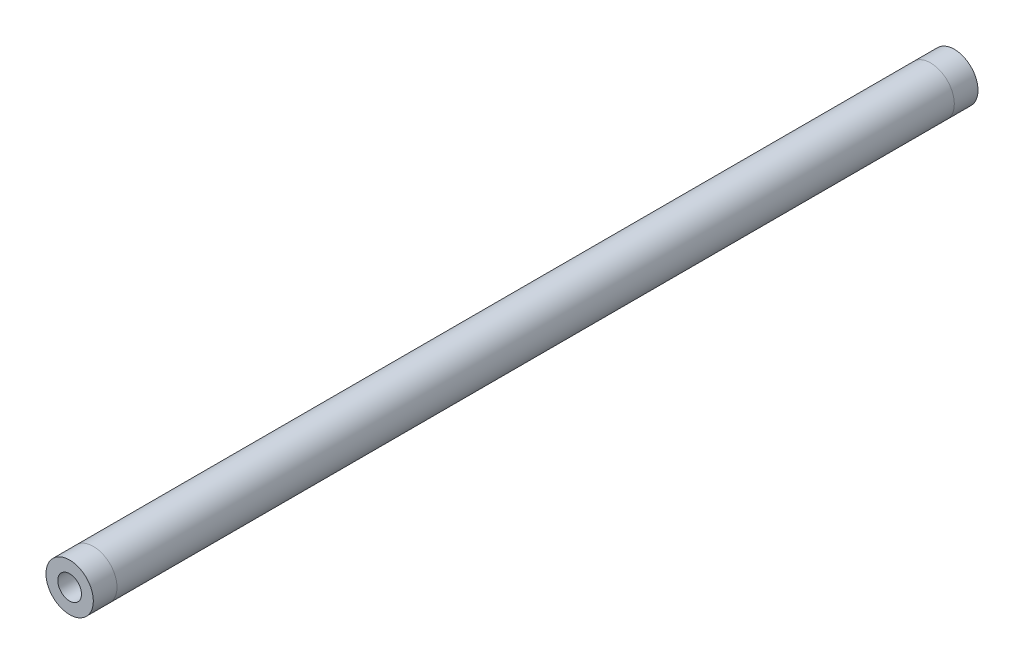
ISO-10303-21;
HEADER;
FILE_DESCRIPTION(('STEP AP214'),'2;1');
FILE_NAME('part.step','',(''),(''),'','','');
FILE_SCHEMA(('AUTOMOTIVE_DESIGN { 1 0 10303 214 1 1 1 1 }'));
ENDSEC;
DATA;
#1=APPLICATION_CONTEXT('core data for automotive mechanical design processes');
#2=APPLICATION_PROTOCOL_DEFINITION('international standard','automotive_design',2000,#1);
#3=PRODUCT_CONTEXT('',#1,'mechanical');
#4=PRODUCT('Part','Part','',(#3));
#5=PRODUCT_RELATED_PRODUCT_CATEGORY('part','',(#4));
#6=PRODUCT_DEFINITION_FORMATION('','',#4);
#7=PRODUCT_DEFINITION_CONTEXT('part definition',#1,'design');
#8=PRODUCT_DEFINITION('design','',#6,#7);
#9=PRODUCT_DEFINITION_SHAPE('','',#8);
#10=(LENGTH_UNIT() NAMED_UNIT(*) SI_UNIT(.MILLI.,.METRE.));
#11=(NAMED_UNIT(*) PLANE_ANGLE_UNIT() SI_UNIT($,.RADIAN.));
#12=(NAMED_UNIT(*) SI_UNIT($,.STERADIAN.) SOLID_ANGLE_UNIT());
#13=UNCERTAINTY_MEASURE_WITH_UNIT(LENGTH_MEASURE(1.E-05),#10,'distance_accuracy_value','');
#14=(GEOMETRIC_REPRESENTATION_CONTEXT(3) GLOBAL_UNCERTAINTY_ASSIGNED_CONTEXT((#13)) GLOBAL_UNIT_ASSIGNED_CONTEXT((#10,
#11,#12)) REPRESENTATION_CONTEXT('',''));
#15=CARTESIAN_POINT('',(0.,0.,0.));
#16=DIRECTION('',(0.,0.,1.));
#17=DIRECTION('',(1.,0.,0.));
#18=AXIS2_PLACEMENT_3D('',#15,#16,#17);
#19=CARTESIAN_POINT('',(0.,0.,-237.20562968286));
#20=DIRECTION('',(0.,0.,1.));
#21=DIRECTION('',(1.,0.,0.));
#22=AXIS2_PLACEMENT_3D('',#19,#20,#21);
#23=CYLINDRICAL_SURFACE('',#22,6.35);
#24=CARTESIAN_POINT('',(0.,0.,-237.20562968286));
#25=DIRECTION('',(0.,0.,1.));
#26=DIRECTION('',(1.,0.,0.));
#27=AXIS2_PLACEMENT_3D('',#24,#25,#26);
#28=CIRCLE('',#27,6.35);
#29=CARTESIAN_POINT('',(6.35,0.,-237.20562968286));
#30=VERTEX_POINT('',#29);
#31=EDGE_CURVE('E83',#30,#30,#28,.T.);
#32=ORIENTED_EDGE('',*,*,#31,.T.);
#33=EDGE_LOOP('',(#32));
#34=FACE_BOUND('',#33,.T.);
#35=CARTESIAN_POINT('',(0.,0.,-230.85562968286));
#36=DIRECTION('',(0.,0.,1.));
#37=DIRECTION('',(1.,0.,0.));
#38=AXIS2_PLACEMENT_3D('',#35,#36,#37);
#39=CIRCLE('',#38,6.35);
#40=CARTESIAN_POINT('',(6.35,0.,-230.85562968286));
#41=VERTEX_POINT('',#40);
#42=EDGE_CURVE('E79',#41,#41,#39,.T.);
#43=ORIENTED_EDGE('',*,*,#42,.F.);
#44=EDGE_LOOP('',(#43));
#45=FACE_BOUND('',#44,.T.);
#46=ADVANCED_FACE('F76',(#34,#45),#23,.T.);
#47=CARTESIAN_POINT('',(0.,0.,-237.20562968286));
#48=DIRECTION('',(0.,0.,1.));
#49=DIRECTION('',(1.,0.,0.));
#50=AXIS2_PLACEMENT_3D('',#47,#48,#49);
#51=PLANE('',#50);
#52=CARTESIAN_POINT('',(0.,0.,-237.20562968286));
#53=DIRECTION('',(0.,0.,1.));
#54=DIRECTION('',(1.,0.,0.));
#55=AXIS2_PLACEMENT_3D('',#52,#53,#54);
#56=CIRCLE('',#55,3.175);
#57=CARTESIAN_POINT('',(3.175,0.,-237.20562968286));
#58=VERTEX_POINT('',#57);
#59=EDGE_CURVE('E92',#58,#58,#56,.T.);
#60=ORIENTED_EDGE('',*,*,#59,.T.);
#61=EDGE_LOOP('',(#60));
#62=FACE_BOUND('',#61,.T.);
#63=ORIENTED_EDGE('',*,*,#31,.F.);
#64=EDGE_LOOP('',(#63));
#65=FACE_BOUND('',#64,.T.);
#66=ADVANCED_FACE('F119',(#62,#65),#51,.F.);
#67=CARTESIAN_POINT('',(0.,0.,-230.85562968286));
#68=DIRECTION('',(0.,0.,1.));
#69=DIRECTION('',(1.,0.,0.));
#70=AXIS2_PLACEMENT_3D('',#67,#68,#69);
#71=PLANE('',#70);
#72=CARTESIAN_POINT('',(0.,0.,-230.85562968286));
#73=DIRECTION('',(0.,0.,1.));
#74=DIRECTION('',(1.,0.,0.));
#75=AXIS2_PLACEMENT_3D('',#72,#73,#74);
#76=CIRCLE('',#75,4.826);
#77=CARTESIAN_POINT('',(-4.826,0.,-230.85562968286));
#78=VERTEX_POINT('',#77);
#79=EDGE_CURVE('E12',#78,#78,#76,.T.);
#80=ORIENTED_EDGE('',*,*,#79,.F.);
#81=EDGE_LOOP('',(#80));
#82=FACE_BOUND('',#81,.T.);
#83=ORIENTED_EDGE('',*,*,#42,.T.);
#84=EDGE_LOOP('',(#83));
#85=FACE_BOUND('',#84,.T.);
#86=ADVANCED_FACE('F115',(#82,#85),#71,.T.);
#87=CARTESIAN_POINT('',(0.,0.,-237.20562968286));
#88=DIRECTION('',(0.,0.,1.));
#89=DIRECTION('',(1.,0.,0.));
#90=AXIS2_PLACEMENT_3D('',#87,#88,#89);
#91=CYLINDRICAL_SURFACE('',#90,3.175);
#92=ORIENTED_EDGE('',*,*,#59,.F.);
#93=EDGE_LOOP('',(#92));
#94=FACE_BOUND('',#93,.T.);
#95=CARTESIAN_POINT('',(0.,0.,-221.33062968286));
#96=DIRECTION('',(0.,0.,1.));
#97=DIRECTION('',(1.,0.,0.));
#98=AXIS2_PLACEMENT_3D('',#95,#96,#97);
#99=CIRCLE('',#98,3.175);
#100=CARTESIAN_POINT('',(3.175,0.,-221.33062968286));
#101=VERTEX_POINT('',#100);
#102=EDGE_CURVE('E98',#101,#101,#99,.T.);
#103=ORIENTED_EDGE('',*,*,#102,.T.);
#104=EDGE_LOOP('',(#103));
#105=FACE_BOUND('',#104,.T.);
#106=ADVANCED_FACE('F104',(#94,#105),#91,.F.);
#107=CARTESIAN_POINT('',(0.,0.,-221.33062968286));
#108=DIRECTION('',(0.,0.,1.));
#109=DIRECTION('',(1.,0.,0.));
#110=AXIS2_PLACEMENT_3D('',#107,#108,#109);
#111=PLANE('',#110);
#112=CARTESIAN_POINT('',(0.,0.,-221.33062968286));
#113=DIRECTION('',(0.,0.,1.));
#114=DIRECTION('',(1.,0.,0.));
#115=AXIS2_PLACEMENT_3D('',#112,#113,#114);
#116=CIRCLE('',#115,4.826);
#117=CARTESIAN_POINT('',(-4.826,0.,-221.33062968286));
#118=VERTEX_POINT('',#117);
#119=EDGE_CURVE('E90',#118,#118,#116,.T.);
#120=ORIENTED_EDGE('',*,*,#119,.T.);
#121=EDGE_LOOP('',(#120));
#122=FACE_BOUND('',#121,.T.);
#123=ORIENTED_EDGE('',*,*,#102,.F.);
#124=EDGE_LOOP('',(#123));
#125=FACE_BOUND('',#124,.T.);
#126=ADVANCED_FACE('F106',(#122,#125),#111,.T.);
#127=CARTESIAN_POINT('',(0.,0.,-221.33062968286));
#128=DIRECTION('',(0.,0.,-1.));
#129=DIRECTION('',(-1.,0.,0.));
#130=AXIS2_PLACEMENT_3D('',#127,#128,#129);
#131=CYLINDRICAL_SURFACE('',#130,4.826);
#132=CARTESIAN_POINT('',(-4.826,0.,-221.33062968286));
#133=CARTESIAN_POINT('',(-4.826,0.,-221.42984843286));
#134=CARTESIAN_POINT('',(-4.826,0.,-221.52906718286));
#135=CARTESIAN_POINT('',(-4.826,0.,-221.72750468286));
#136=CARTESIAN_POINT('',(-4.826,0.,-221.82672343286));
#137=CARTESIAN_POINT('',(-4.826,0.,-222.02516093286));
#138=CARTESIAN_POINT('',(-4.826,0.,-222.12437968286));
#139=CARTESIAN_POINT('',(-4.826,0.,-222.32281718286));
#140=CARTESIAN_POINT('',(-4.826,0.,-222.42203593286));
#141=CARTESIAN_POINT('',(-4.826,0.,-222.62047343286));
#142=CARTESIAN_POINT('',(-4.826,0.,-222.71969218286));
#143=CARTESIAN_POINT('',(-4.826,0.,-222.91812968286));
#144=CARTESIAN_POINT('',(-4.826,0.,-223.01734843286));
#145=CARTESIAN_POINT('',(-4.826,0.,-223.21578593286));
#146=CARTESIAN_POINT('',(-4.826,0.,-223.31500468286));
#147=CARTESIAN_POINT('',(-4.826,0.,-223.51344218286));
#148=CARTESIAN_POINT('',(-4.826,0.,-223.61266093286));
#149=CARTESIAN_POINT('',(-4.826,0.,-223.81109843286));
#150=CARTESIAN_POINT('',(-4.826,0.,-223.91031718286));
#151=CARTESIAN_POINT('',(-4.826,0.,-224.10875468286));
#152=CARTESIAN_POINT('',(-4.826,0.,-224.20797343286));
#153=CARTESIAN_POINT('',(-4.826,0.,-224.40641093286));
#154=CARTESIAN_POINT('',(-4.826,0.,-224.50562968286));
#155=CARTESIAN_POINT('',(-4.826,0.,-224.70406718286));
#156=CARTESIAN_POINT('',(-4.826,0.,-224.80328593286));
#157=CARTESIAN_POINT('',(-4.826,0.,-225.00172343286));
#158=CARTESIAN_POINT('',(-4.826,0.,-225.10094218286));
#159=CARTESIAN_POINT('',(-4.826,0.,-225.29937968286));
#160=CARTESIAN_POINT('',(-4.826,0.,-225.39859843286));
#161=CARTESIAN_POINT('',(-4.826,0.,-225.59703593286));
#162=CARTESIAN_POINT('',(-4.826,0.,-225.69625468286));
#163=CARTESIAN_POINT('',(-4.826,0.,-225.89469218286));
#164=CARTESIAN_POINT('',(-4.826,0.,-225.99391093286));
#165=CARTESIAN_POINT('',(-4.826,0.,-226.19234843286));
#166=CARTESIAN_POINT('',(-4.826,0.,-226.29156718286));
#167=CARTESIAN_POINT('',(-4.826,0.,-226.49000468286));
#168=CARTESIAN_POINT('',(-4.826,0.,-226.58922343286));
#169=CARTESIAN_POINT('',(-4.826,0.,-226.78766093286));
#170=CARTESIAN_POINT('',(-4.826,0.,-226.88687968286));
#171=CARTESIAN_POINT('',(-4.826,0.,-227.08531718286));
#172=CARTESIAN_POINT('',(-4.826,0.,-227.18453593286));
#173=CARTESIAN_POINT('',(-4.826,0.,-227.38297343286));
#174=CARTESIAN_POINT('',(-4.826,0.,-227.48219218286));
#175=CARTESIAN_POINT('',(-4.826,0.,-227.68062968286));
#176=CARTESIAN_POINT('',(-4.826,0.,-227.77984843286));
#177=CARTESIAN_POINT('',(-4.826,0.,-227.97828593286));
#178=CARTESIAN_POINT('',(-4.826,0.,-228.07750468286));
#179=CARTESIAN_POINT('',(-4.826,0.,-228.27594218286));
#180=CARTESIAN_POINT('',(-4.826,0.,-228.37516093286));
#181=CARTESIAN_POINT('',(-4.826,0.,-228.57359843286));
#182=CARTESIAN_POINT('',(-4.826,0.,-228.67281718286));
#183=CARTESIAN_POINT('',(-4.826,0.,-228.87125468286));
#184=CARTESIAN_POINT('',(-4.826,0.,-228.97047343286));
#185=CARTESIAN_POINT('',(-4.826,0.,-229.16891093286));
#186=CARTESIAN_POINT('',(-4.826,0.,-229.26812968286));
#187=CARTESIAN_POINT('',(-4.826,0.,-229.46656718286));
#188=CARTESIAN_POINT('',(-4.826,0.,-229.56578593286));
#189=CARTESIAN_POINT('',(-4.826,0.,-229.76422343286));
#190=CARTESIAN_POINT('',(-4.826,0.,-229.86344218286));
#191=CARTESIAN_POINT('',(-4.826,0.,-230.06187968286));
#192=CARTESIAN_POINT('',(-4.826,0.,-230.16109843286));
#193=CARTESIAN_POINT('',(-4.826,0.,-230.35953593286));
#194=CARTESIAN_POINT('',(-4.826,0.,-230.45875468286));
#195=CARTESIAN_POINT('',(-4.826,0.,-230.65719218286));
#196=CARTESIAN_POINT('',(-4.826,0.,-230.75641093286));
#197=CARTESIAN_POINT('',(-4.826,0.,-230.85562968286));
#198=B_SPLINE_CURVE_WITH_KNOTS('',3,(#132,#133,#134,#135,#136,#137,#138,#139,#140,#141,#142,
#143,#144,#145,#146,#147,#148,#149,#150,#151,#152,#153,#154,#155,#156,#157,#158,#159,#160,#161,
#162,#163,#164,#165,#166,#167,#168,#169,#170,#171,#172,#173,#174,#175,#176,#177,#178,#179,#180,
#181,#182,#183,#184,#185,#186,#187,#188,#189,#190,#191,#192,#193,#194,#195,#196,#197),
.UNSPECIFIED.,.F.,.F.,(4,2,2,2,2,2,2,2,2,2,2,2,2,2,2,2,2,2,2,2,2,2,2,2,2,2,2,2,2,2,2,2,4),(0.,
0.297656249999972,0.595312499999973,0.892968749999973,1.19062499999997,1.48828124999997,
1.78593749999997,2.08359374999997,2.38124999999997,2.67890624999997,2.97656249999997,
3.27421874999997,3.57187499999997,3.86953124999997,4.16718749999997,4.46484374999998,
4.76249999999998,5.06015624999998,5.35781249999998,5.65546874999998,5.95312499999998,
6.25078124999998,6.54843749999998,6.84609374999998,7.14374999999998,7.44140624999998,
7.73906249999998,8.03671874999998,8.33437499999998,8.63203124999998,8.92968749999998,
9.22734374999998,9.52499999999998),.UNSPECIFIED.);
#199=EDGE_CURVE('BSEAM108',#118,#78,#198,.T.);
#200=ORIENTED_EDGE('',*,*,#119,.F.);
#201=ORIENTED_EDGE('',*,*,#79,.T.);
#202=ORIENTED_EDGE('',*,*,#199,.T.);
#203=ORIENTED_EDGE('',*,*,#199,.F.);
#204=EDGE_LOOP('',(#200,#202,#201,#203));
#205=FACE_BOUND('',#204,.T.);
#206=ADVANCED_FACE('F108',(#205),#131,.T.);
#207=CLOSED_SHELL('',(#46,#66,#86,#106,#126,#206));
#208=MANIFOLD_SOLID_BREP('B2',#207);
#209=CARTESIAN_POINT('',(0.,0.,-230.85562968286));
#210=DIRECTION('',(0.,0.,1.));
#211=DIRECTION('',(1.,0.,0.));
#212=AXIS2_PLACEMENT_3D('',#209,#210,#211);
#213=CYLINDRICAL_SURFACE('',#212,6.35);
#214=CARTESIAN_POINT('',(0.,0.,-230.85562968286));
#215=DIRECTION('',(0.,0.,1.));
#216=DIRECTION('',(1.,0.,0.));
#217=AXIS2_PLACEMENT_3D('',#214,#215,#216);
#218=CIRCLE('',#217,6.35);
#219=CARTESIAN_POINT('',(6.35,0.,-230.85562968286));
#220=VERTEX_POINT('',#219);
#221=EDGE_CURVE('E75',#220,#220,#218,.T.);
#222=CARTESIAN_POINT('',(0.,0.,-6.35));
#223=DIRECTION('',(0.,0.,1.));
#224=DIRECTION('',(1.,0.,0.));
#225=AXIS2_PLACEMENT_3D('',#222,#223,#224);
#226=CIRCLE('',#225,6.35);
#227=CARTESIAN_POINT('',(6.35,0.,-6.35000000000002));
#228=VERTEX_POINT('',#227);
#229=EDGE_CURVE('E191',#228,#228,#226,.T.);
#230=CARTESIAN_POINT('',(6.35,0.,-230.85562968286));
#231=CARTESIAN_POINT('',(6.35,0.,-228.517029373664));
#232=CARTESIAN_POINT('',(6.35,0.,-226.178429064467));
#233=CARTESIAN_POINT('',(6.35,0.,-221.501228446074));
#234=CARTESIAN_POINT('',(6.35,0.,-219.162628136878));
#235=CARTESIAN_POINT('',(6.35,0.,-214.485427518485));
#236=CARTESIAN_POINT('',(6.35,0.,-212.146827209289));
#237=CARTESIAN_POINT('',(6.35,0.,-207.469626590896));
#238=CARTESIAN_POINT('',(6.35,0.,-205.131026281699));
#239=CARTESIAN_POINT('',(6.35,0.,-200.453825663306));
#240=CARTESIAN_POINT('',(6.35,0.,-198.11522535411));
#241=CARTESIAN_POINT('',(6.35,0.,-193.438024735717));
#242=CARTESIAN_POINT('',(6.35,0.,-191.09942442652));
#243=CARTESIAN_POINT('',(6.35,0.,-186.422223808128));
#244=CARTESIAN_POINT('',(6.35,0.,-184.083623498931));
#245=CARTESIAN_POINT('',(6.35,0.,-179.406422880538));
#246=CARTESIAN_POINT('',(6.35,0.,-177.067822571342));
#247=CARTESIAN_POINT('',(6.35,0.,-172.390621952949));
#248=CARTESIAN_POINT('',(6.35,0.,-170.052021643752));
#249=CARTESIAN_POINT('',(6.35,0.,-165.374821025359));
#250=CARTESIAN_POINT('',(6.35,0.,-163.036220716163));
#251=CARTESIAN_POINT('',(6.35,0.,-158.35902009777));
#252=CARTESIAN_POINT('',(6.35,0.,-156.020419788574));
#253=CARTESIAN_POINT('',(6.35,0.,-151.343219170181));
#254=CARTESIAN_POINT('',(6.35,0.,-149.004618860984));
#255=CARTESIAN_POINT('',(6.35,0.,-144.327418242591));
#256=CARTESIAN_POINT('',(6.35,0.,-141.988817933395));
#257=CARTESIAN_POINT('',(6.35,0.,-137.311617315002));
#258=CARTESIAN_POINT('',(6.35,0.,-134.973017005805));
#259=CARTESIAN_POINT('',(6.35,0.,-130.295816387412));
#260=CARTESIAN_POINT('',(6.35,0.,-127.957216078216));
#261=CARTESIAN_POINT('',(6.35,0.,-123.280015459823));
#262=CARTESIAN_POINT('',(6.35,0.,-120.941415150627));
#263=CARTESIAN_POINT('',(6.35,0.,-116.264214532234));
#264=CARTESIAN_POINT('',(6.35,0.,-113.925614223037));
#265=CARTESIAN_POINT('',(6.35,0.,-109.248413604644));
#266=CARTESIAN_POINT('',(6.35,0.,-106.909813295448));
#267=CARTESIAN_POINT('',(6.35,0.,-102.232612677055));
#268=CARTESIAN_POINT('',(6.35,0.,-99.8940123678585));
#269=CARTESIAN_POINT('',(6.35,0.,-95.2168117494656));
#270=CARTESIAN_POINT('',(6.35,0.,-92.8782114402691));
#271=CARTESIAN_POINT('',(6.35,0.,-88.2010108218762));
#272=CARTESIAN_POINT('',(6.35,0.,-85.8624105126797));
#273=CARTESIAN_POINT('',(6.35,0.,-81.1852098942868));
#274=CARTESIAN_POINT('',(6.35,0.,-78.8466095850903));
#275=CARTESIAN_POINT('',(6.35,0.,-74.1694089666974));
#276=CARTESIAN_POINT('',(6.35,0.,-71.830808657501));
#277=CARTESIAN_POINT('',(6.35,0.,-67.153608039108));
#278=CARTESIAN_POINT('',(6.35,0.,-64.8150077299116));
#279=CARTESIAN_POINT('',(6.35,0.,-60.1378071115186));
#280=CARTESIAN_POINT('',(6.35,0.,-57.7992068023222));
#281=CARTESIAN_POINT('',(6.35,0.,-53.1220061839292));
#282=CARTESIAN_POINT('',(6.35,0.,-50.7834058747328));
#283=CARTESIAN_POINT('',(6.35,0.,-46.1062052563399));
#284=CARTESIAN_POINT('',(6.35,0.,-43.7676049471434));
#285=CARTESIAN_POINT('',(6.35,0.,-39.0904043287505));
#286=CARTESIAN_POINT('',(6.35,0.,-36.751804019554));
#287=CARTESIAN_POINT('',(6.35,0.,-32.0746034011611));
#288=CARTESIAN_POINT('',(6.35,0.,-29.7360030919646));
#289=CARTESIAN_POINT('',(6.35,0.,-25.0588024735717));
#290=CARTESIAN_POINT('',(6.35,0.,-22.7202021643752));
#291=CARTESIAN_POINT('',(6.35,0.,-18.0430015459823));
#292=CARTESIAN_POINT('',(6.35,0.,-15.7044012367859));
#293=CARTESIAN_POINT('',(6.35,0.,-11.0272006183929));
#294=CARTESIAN_POINT('',(6.35,0.,-8.68860030919648));
#295=CARTESIAN_POINT('',(6.35,0.,-6.35000000000002));
#296=B_SPLINE_CURVE_WITH_KNOTS('',3,(#230,#231,#232,#233,#234,#235,#236,#237,#238,#239,#240,
#241,#242,#243,#244,#245,#246,#247,#248,#249,#250,#251,#252,#253,#254,#255,#256,#257,#258,#259,
#260,#261,#262,#263,#264,#265,#266,#267,#268,#269,#270,#271,#272,#273,#274,#275,#276,#277,#278,
#279,#280,#281,#282,#283,#284,#285,#286,#287,#288,#289,#290,#291,#292,#293,#294,#295),
.UNSPECIFIED.,.F.,.F.,(4,2,2,2,2,2,2,2,2,2,2,2,2,2,2,2,2,2,2,2,2,2,2,2,2,2,2,2,2,2,2,2,4),(0.,
7.01580092758938,14.0316018551788,21.0474027827681,28.0632037103575,35.0790046379469,
42.0948055655363,49.1106064931257,56.1264074207151,63.1422083483044,70.1580092758938,
77.1738102034832,84.1896111310726,91.205412058662,98.2212129862514,105.237013913841,
112.25281484143,119.26861576902,126.284416696609,133.300217624198,140.316018551788,
147.331819479377,154.347620406966,161.363421334556,168.379222262145,175.395023189735,
182.410824117324,189.426625044913,196.442425972503,203.458226900092,210.474027827682,
217.489828755271,224.50562968286),.UNSPECIFIED.);
#297=EDGE_CURVE('BSEAM188',#220,#228,#296,.T.);
#298=ORIENTED_EDGE('',*,*,#221,.T.);
#299=ORIENTED_EDGE('',*,*,#229,.F.);
#300=ORIENTED_EDGE('',*,*,#297,.T.);
#301=ORIENTED_EDGE('',*,*,#297,.F.);
#302=EDGE_LOOP('',(#298,#300,#299,#301));
#303=FACE_BOUND('',#302,.T.);
#304=ADVANCED_FACE('F188',(#303),#213,.T.);
#305=CARTESIAN_POINT('',(0.,0.,-230.85562968286));
#306=DIRECTION('',(0.,0.,1.));
#307=DIRECTION('',(1.,0.,0.));
#308=AXIS2_PLACEMENT_3D('',#305,#306,#307);
#309=PLANE('',#308);
#310=CARTESIAN_POINT('',(0.,0.,-230.85562968286));
#311=DIRECTION('',(0.,0.,1.));
#312=DIRECTION('',(1.,0.,0.));
#313=AXIS2_PLACEMENT_3D('',#310,#311,#312);
#314=CIRCLE('',#313,4.826);
#315=CARTESIAN_POINT('',(4.826,0.,-230.85562968286));
#316=VERTEX_POINT('',#315);
#317=EDGE_CURVE('E198',#316,#316,#314,.T.);
#318=ORIENTED_EDGE('',*,*,#317,.T.);
#319=EDGE_LOOP('',(#318));
#320=FACE_BOUND('',#319,.T.);
#321=ORIENTED_EDGE('',*,*,#221,.F.);
#322=EDGE_LOOP('',(#321));
#323=FACE_BOUND('',#322,.T.);
#324=ADVANCED_FACE('F206',(#320,#323),#309,.F.);
#325=CARTESIAN_POINT('',(0.,0.,-6.35));
#326=DIRECTION('',(0.,0.,1.));
#327=DIRECTION('',(1.,0.,0.));
#328=AXIS2_PLACEMENT_3D('',#325,#326,#327);
#329=PLANE('',#328);
#330=CARTESIAN_POINT('',(0.,0.,-6.35));
#331=DIRECTION('',(0.,0.,1.));
#332=DIRECTION('',(1.,0.,0.));
#333=AXIS2_PLACEMENT_3D('',#330,#331,#332);
#334=CIRCLE('',#333,4.826);
#335=CARTESIAN_POINT('',(4.826,0.,-6.35000000000002));
#336=VERTEX_POINT('',#335);
#337=EDGE_CURVE('E200',#336,#336,#334,.T.);
#338=ORIENTED_EDGE('',*,*,#337,.F.);
#339=EDGE_LOOP('',(#338));
#340=FACE_BOUND('',#339,.T.);
#341=ORIENTED_EDGE('',*,*,#229,.T.);
#342=EDGE_LOOP('',(#341));
#343=FACE_BOUND('',#342,.T.);
#344=ADVANCED_FACE('F212',(#340,#343),#329,.T.);
#345=CARTESIAN_POINT('',(0.,0.,-230.85562968286));
#346=DIRECTION('',(0.,0.,1.));
#347=DIRECTION('',(1.,0.,0.));
#348=AXIS2_PLACEMENT_3D('',#345,#346,#347);
#349=CYLINDRICAL_SURFACE('',#348,4.826);
#350=CARTESIAN_POINT('',(4.826,0.,-230.85562968286));
#351=CARTESIAN_POINT('',(4.826,0.,-228.517029373664));
#352=CARTESIAN_POINT('',(4.826,0.,-226.178429064467));
#353=CARTESIAN_POINT('',(4.826,0.,-221.501228446074));
#354=CARTESIAN_POINT('',(4.826,0.,-219.162628136878));
#355=CARTESIAN_POINT('',(4.826,0.,-214.485427518485));
#356=CARTESIAN_POINT('',(4.826,0.,-212.146827209289));
#357=CARTESIAN_POINT('',(4.826,0.,-207.469626590896));
#358=CARTESIAN_POINT('',(4.826,0.,-205.131026281699));
#359=CARTESIAN_POINT('',(4.826,0.,-200.453825663306));
#360=CARTESIAN_POINT('',(4.826,0.,-198.11522535411));
#361=CARTESIAN_POINT('',(4.826,0.,-193.438024735717));
#362=CARTESIAN_POINT('',(4.826,0.,-191.09942442652));
#363=CARTESIAN_POINT('',(4.826,0.,-186.422223808128));
#364=CARTESIAN_POINT('',(4.826,0.,-184.083623498931));
#365=CARTESIAN_POINT('',(4.826,0.,-179.406422880538));
#366=CARTESIAN_POINT('',(4.826,0.,-177.067822571342));
#367=CARTESIAN_POINT('',(4.826,0.,-172.390621952949));
#368=CARTESIAN_POINT('',(4.826,0.,-170.052021643752));
#369=CARTESIAN_POINT('',(4.826,0.,-165.374821025359));
#370=CARTESIAN_POINT('',(4.826,0.,-163.036220716163));
#371=CARTESIAN_POINT('',(4.826,0.,-158.35902009777));
#372=CARTESIAN_POINT('',(4.826,0.,-156.020419788574));
#373=CARTESIAN_POINT('',(4.826,0.,-151.343219170181));
#374=CARTESIAN_POINT('',(4.826,0.,-149.004618860984));
#375=CARTESIAN_POINT('',(4.826,0.,-144.327418242591));
#376=CARTESIAN_POINT('',(4.826,0.,-141.988817933395));
#377=CARTESIAN_POINT('',(4.826,0.,-137.311617315002));
#378=CARTESIAN_POINT('',(4.826,0.,-134.973017005805));
#379=CARTESIAN_POINT('',(4.826,0.,-130.295816387412));
#380=CARTESIAN_POINT('',(4.826,0.,-127.957216078216));
#381=CARTESIAN_POINT('',(4.826,0.,-123.280015459823));
#382=CARTESIAN_POINT('',(4.826,0.,-120.941415150627));
#383=CARTESIAN_POINT('',(4.826,0.,-116.264214532234));
#384=CARTESIAN_POINT('',(4.826,0.,-113.925614223037));
#385=CARTESIAN_POINT('',(4.826,0.,-109.248413604644));
#386=CARTESIAN_POINT('',(4.826,0.,-106.909813295448));
#387=CARTESIAN_POINT('',(4.826,0.,-102.232612677055));
#388=CARTESIAN_POINT('',(4.826,0.,-99.8940123678585));
#389=CARTESIAN_POINT('',(4.826,0.,-95.2168117494656));
#390=CARTESIAN_POINT('',(4.826,0.,-92.8782114402691));
#391=CARTESIAN_POINT('',(4.826,0.,-88.2010108218762));
#392=CARTESIAN_POINT('',(4.826,0.,-85.8624105126797));
#393=CARTESIAN_POINT('',(4.826,0.,-81.1852098942868));
#394=CARTESIAN_POINT('',(4.826,0.,-78.8466095850903));
#395=CARTESIAN_POINT('',(4.826,0.,-74.1694089666974));
#396=CARTESIAN_POINT('',(4.826,0.,-71.830808657501));
#397=CARTESIAN_POINT('',(4.826,0.,-67.153608039108));
#398=CARTESIAN_POINT('',(4.826,0.,-64.8150077299116));
#399=CARTESIAN_POINT('',(4.826,0.,-60.1378071115186));
#400=CARTESIAN_POINT('',(4.826,0.,-57.7992068023222));
#401=CARTESIAN_POINT('',(4.826,0.,-53.1220061839293));
#402=CARTESIAN_POINT('',(4.826,0.,-50.7834058747328));
#403=CARTESIAN_POINT('',(4.826,0.,-46.1062052563399));
#404=CARTESIAN_POINT('',(4.826,0.,-43.7676049471434));
#405=CARTESIAN_POINT('',(4.826,0.,-39.0904043287505));
#406=CARTESIAN_POINT('',(4.826,0.,-36.751804019554));
#407=CARTESIAN_POINT('',(4.826,0.,-32.0746034011611));
#408=CARTESIAN_POINT('',(4.826,0.,-29.7360030919646));
#409=CARTESIAN_POINT('',(4.826,0.,-25.0588024735717));
#410=CARTESIAN_POINT('',(4.826,0.,-22.7202021643753));
#411=CARTESIAN_POINT('',(4.826,0.,-18.0430015459823));
#412=CARTESIAN_POINT('',(4.826,0.,-15.7044012367859));
#413=CARTESIAN_POINT('',(4.826,0.,-11.0272006183929));
#414=CARTESIAN_POINT('',(4.826,0.,-8.68860030919648));
#415=CARTESIAN_POINT('',(4.826,0.,-6.35000000000002));
#416=B_SPLINE_CURVE_WITH_KNOTS('',3,(#350,#351,#352,#353,#354,#355,#356,#357,#358,#359,#360,
#361,#362,#363,#364,#365,#366,#367,#368,#369,#370,#371,#372,#373,#374,#375,#376,#377,#378,#379,
#380,#381,#382,#383,#384,#385,#386,#387,#388,#389,#390,#391,#392,#393,#394,#395,#396,#397,#398,
#399,#400,#401,#402,#403,#404,#405,#406,#407,#408,#409,#410,#411,#412,#413,#414,#415),
.UNSPECIFIED.,.F.,.F.,(4,2,2,2,2,2,2,2,2,2,2,2,2,2,2,2,2,2,2,2,2,2,2,2,2,2,2,2,2,2,2,2,4),(0.,
7.01580092758941,14.0316018551788,21.0474027827682,28.0632037103576,35.0790046379469,
42.0948055655363,49.1106064931257,56.1264074207151,63.1422083483045,70.1580092758939,
77.1738102034832,84.1896111310726,91.205412058662,98.2212129862514,105.237013913841,
112.25281484143,119.26861576902,126.284416696609,133.300217624198,140.316018551788,
147.331819479377,154.347620406966,161.363421334556,168.379222262145,175.395023189735,
182.410824117324,189.426625044913,196.442425972503,203.458226900092,210.474027827682,
217.489828755271,224.50562968286),.UNSPECIFIED.);
#417=EDGE_CURVE('BSEAM209',#316,#336,#416,.T.);
#418=ORIENTED_EDGE('',*,*,#317,.F.);
#419=ORIENTED_EDGE('',*,*,#337,.T.);
#420=ORIENTED_EDGE('',*,*,#417,.T.);
#421=ORIENTED_EDGE('',*,*,#417,.F.);
#422=EDGE_LOOP('',(#418,#420,#419,#421));
#423=FACE_BOUND('',#422,.T.);
#424=ADVANCED_FACE('F209',(#423),#349,.F.);
#425=CLOSED_SHELL('',(#304,#324,#344,#424));
#426=MANIFOLD_SOLID_BREP('B7',#425);
#427=CARTESIAN_POINT('',(0.,0.,-6.35));
#428=DIRECTION('',(0.,0.,1.));
#429=DIRECTION('',(1.,0.,0.));
#430=AXIS2_PLACEMENT_3D('',#427,#428,#429);
#431=CYLINDRICAL_SURFACE('',#430,6.35);
#432=CARTESIAN_POINT('',(0.,0.,-6.35));
#433=DIRECTION('',(0.,0.,1.));
#434=DIRECTION('',(1.,0.,0.));
#435=AXIS2_PLACEMENT_3D('',#432,#433,#434);
#436=CIRCLE('',#435,6.35);
#437=CARTESIAN_POINT('',(6.35,0.,-6.35));
#438=VERTEX_POINT('',#437);
#439=EDGE_CURVE('E187',#438,#438,#436,.T.);
#440=ORIENTED_EDGE('',*,*,#439,.T.);
#441=EDGE_LOOP('',(#440));
#442=FACE_BOUND('',#441,.T.);
#443=CARTESIAN_POINT('',(0.,0.,0.));
#444=DIRECTION('',(0.,0.,1.));
#445=DIRECTION('',(1.,0.,0.));
#446=AXIS2_PLACEMENT_3D('',#443,#444,#445);
#447=CIRCLE('',#446,6.35);
#448=CARTESIAN_POINT('',(6.35,0.,0.));
#449=VERTEX_POINT('',#448);
#450=EDGE_CURVE('E261',#449,#449,#447,.T.);
#451=ORIENTED_EDGE('',*,*,#450,.F.);
#452=EDGE_LOOP('',(#451));
#453=FACE_BOUND('',#452,.T.);
#454=ADVANCED_FACE('F250',(#442,#453),#431,.T.);
#455=CARTESIAN_POINT('',(0.,0.,-6.35));
#456=DIRECTION('',(0.,0.,1.));
#457=DIRECTION('',(1.,0.,0.));
#458=AXIS2_PLACEMENT_3D('',#455,#456,#457);
#459=CYLINDRICAL_SURFACE('',#458,3.175);
#460=CARTESIAN_POINT('',(0.,0.,0.));
#461=DIRECTION('',(0.,0.,1.));
#462=DIRECTION('',(1.,0.,0.));
#463=AXIS2_PLACEMENT_3D('',#460,#461,#462);
#464=CIRCLE('',#463,3.175);
#465=CARTESIAN_POINT('',(3.175,0.,0.));
#466=VERTEX_POINT('',#465);
#467=EDGE_CURVE('E253',#466,#466,#464,.T.);
#468=ORIENTED_EDGE('',*,*,#467,.T.);
#469=EDGE_LOOP('',(#468));
#470=FACE_BOUND('',#469,.T.);
#471=CARTESIAN_POINT('',(0.,0.,-15.875));
#472=DIRECTION('',(0.,0.,1.));
#473=DIRECTION('',(1.,0.,0.));
#474=AXIS2_PLACEMENT_3D('',#471,#472,#473);
#475=CIRCLE('',#474,3.175);
#476=CARTESIAN_POINT('',(3.175,0.,-15.875));
#477=VERTEX_POINT('',#476);
#478=EDGE_CURVE('E273',#477,#477,#475,.T.);
#479=ORIENTED_EDGE('',*,*,#478,.F.);
#480=EDGE_LOOP('',(#479));
#481=FACE_BOUND('',#480,.T.);
#482=ADVANCED_FACE('F281',(#470,#481),#459,.F.);
#483=CARTESIAN_POINT('',(0.,0.,-6.35));
#484=DIRECTION('',(0.,0.,1.));
#485=DIRECTION('',(1.,0.,0.));
#486=AXIS2_PLACEMENT_3D('',#483,#484,#485);
#487=PLANE('',#486);
#488=CARTESIAN_POINT('',(0.,0.,-6.35));
#489=DIRECTION('',(0.,0.,1.));
#490=DIRECTION('',(1.,0.,0.));
#491=AXIS2_PLACEMENT_3D('',#488,#489,#490);
#492=CIRCLE('',#491,4.826);
#493=CARTESIAN_POINT('',(4.826,0.,-6.35));
#494=VERTEX_POINT('',#493);
#495=EDGE_CURVE('E263',#494,#494,#492,.T.);
#496=ORIENTED_EDGE('',*,*,#495,.T.);
#497=EDGE_LOOP('',(#496));
#498=FACE_BOUND('',#497,.T.);
#499=ORIENTED_EDGE('',*,*,#439,.F.);
#500=EDGE_LOOP('',(#499));
#501=FACE_BOUND('',#500,.T.);
#502=ADVANCED_FACE('F283',(#498,#501),#487,.F.);
#503=CARTESIAN_POINT('',(0.,0.,0.));
#504=DIRECTION('',(0.,0.,1.));
#505=DIRECTION('',(1.,0.,0.));
#506=AXIS2_PLACEMENT_3D('',#503,#504,#505);
#507=PLANE('',#506);
#508=ORIENTED_EDGE('',*,*,#450,.T.);
#509=EDGE_LOOP('',(#508));
#510=FACE_BOUND('',#509,.T.);
#511=ORIENTED_EDGE('',*,*,#467,.F.);
#512=EDGE_LOOP('',(#511));
#513=FACE_BOUND('',#512,.T.);
#514=ADVANCED_FACE('F289',(#510,#513),#507,.T.);
#515=CARTESIAN_POINT('',(0.,0.,-15.875));
#516=DIRECTION('',(0.,0.,1.));
#517=DIRECTION('',(1.,0.,0.));
#518=AXIS2_PLACEMENT_3D('',#515,#516,#517);
#519=CYLINDRICAL_SURFACE('',#518,4.826);
#520=CARTESIAN_POINT('',(0.,0.,-15.875));
#521=DIRECTION('',(0.,0.,1.));
#522=DIRECTION('',(1.,0.,0.));
#523=AXIS2_PLACEMENT_3D('',#520,#521,#522);
#524=CIRCLE('',#523,4.826);
#525=CARTESIAN_POINT('',(4.826,0.,-15.875));
#526=VERTEX_POINT('',#525);
#527=EDGE_CURVE('E266',#526,#526,#524,.T.);
#528=CARTESIAN_POINT('',(4.826,0.,-15.875));
#529=CARTESIAN_POINT('',(4.826,0.,-15.77578125));
#530=CARTESIAN_POINT('',(4.826,0.,-15.6765625));
#531=CARTESIAN_POINT('',(4.826,0.,-15.478125));
#532=CARTESIAN_POINT('',(4.826,0.,-15.37890625));
#533=CARTESIAN_POINT('',(4.826,0.,-15.18046875));
#534=CARTESIAN_POINT('',(4.826,0.,-15.08125));
#535=CARTESIAN_POINT('',(4.826,0.,-14.8828125));
#536=CARTESIAN_POINT('',(4.826,0.,-14.78359375));
#537=CARTESIAN_POINT('',(4.826,0.,-14.58515625));
#538=CARTESIAN_POINT('',(4.826,0.,-14.4859375));
#539=CARTESIAN_POINT('',(4.826,0.,-14.2875));
#540=CARTESIAN_POINT('',(4.826,0.,-14.18828125));
#541=CARTESIAN_POINT('',(4.826,0.,-13.98984375));
#542=CARTESIAN_POINT('',(4.826,0.,-13.890625));
#543=CARTESIAN_POINT('',(4.826,0.,-13.6921875));
#544=CARTESIAN_POINT('',(4.826,0.,-13.59296875));
#545=CARTESIAN_POINT('',(4.826,0.,-13.39453125));
#546=CARTESIAN_POINT('',(4.826,0.,-13.2953125));
#547=CARTESIAN_POINT('',(4.826,0.,-13.096875));
#548=CARTESIAN_POINT('',(4.826,0.,-12.99765625));
#549=CARTESIAN_POINT('',(4.826,0.,-12.79921875));
#550=CARTESIAN_POINT('',(4.826,0.,-12.7));
#551=CARTESIAN_POINT('',(4.826,0.,-12.5015625));
#552=CARTESIAN_POINT('',(4.826,0.,-12.40234375));
#553=CARTESIAN_POINT('',(4.826,0.,-12.20390625));
#554=CARTESIAN_POINT('',(4.826,0.,-12.1046875));
#555=CARTESIAN_POINT('',(4.826,0.,-11.90625));
#556=CARTESIAN_POINT('',(4.826,0.,-11.80703125));
#557=CARTESIAN_POINT('',(4.826,0.,-11.60859375));
#558=CARTESIAN_POINT('',(4.826,0.,-11.509375));
#559=CARTESIAN_POINT('',(4.826,0.,-11.3109375));
#560=CARTESIAN_POINT('',(4.826,0.,-11.21171875));
#561=CARTESIAN_POINT('',(4.826,0.,-11.01328125));
#562=CARTESIAN_POINT('',(4.826,0.,-10.9140625));
#563=CARTESIAN_POINT('',(4.826,0.,-10.715625));
#564=CARTESIAN_POINT('',(4.826,0.,-10.61640625));
#565=CARTESIAN_POINT('',(4.826,0.,-10.41796875));
#566=CARTESIAN_POINT('',(4.826,0.,-10.31875));
#567=CARTESIAN_POINT('',(4.826,0.,-10.1203125));
#568=CARTESIAN_POINT('',(4.826,0.,-10.02109375));
#569=CARTESIAN_POINT('',(4.826,0.,-9.82265625));
#570=CARTESIAN_POINT('',(4.826,0.,-9.7234375));
#571=CARTESIAN_POINT('',(4.826,0.,-9.525));
#572=CARTESIAN_POINT('',(4.826,0.,-9.42578125));
#573=CARTESIAN_POINT('',(4.826,0.,-9.22734375));
#574=CARTESIAN_POINT('',(4.826,0.,-9.128125));
#575=CARTESIAN_POINT('',(4.826,0.,-8.9296875));
#576=CARTESIAN_POINT('',(4.826,0.,-8.83046875));
#577=CARTESIAN_POINT('',(4.826,0.,-8.63203125));
#578=CARTESIAN_POINT('',(4.826,0.,-8.5328125));
#579=CARTESIAN_POINT('',(4.826,0.,-8.334375));
#580=CARTESIAN_POINT('',(4.826,0.,-8.23515625));
#581=CARTESIAN_POINT('',(4.826,0.,-8.03671875));
#582=CARTESIAN_POINT('',(4.826,0.,-7.9375));
#583=CARTESIAN_POINT('',(4.826,0.,-7.7390625));
#584=CARTESIAN_POINT('',(4.826,0.,-7.63984375));
#585=CARTESIAN_POINT('',(4.826,0.,-7.44140625));
#586=CARTESIAN_POINT('',(4.826,0.,-7.3421875));
#587=CARTESIAN_POINT('',(4.826,0.,-7.14375));
#588=CARTESIAN_POINT('',(4.826,0.,-7.04453125));
#589=CARTESIAN_POINT('',(4.826,0.,-6.84609375));
#590=CARTESIAN_POINT('',(4.826,0.,-6.746875));
#591=CARTESIAN_POINT('',(4.826,0.,-6.5484375));
#592=CARTESIAN_POINT('',(4.826,0.,-6.44921875));
#593=CARTESIAN_POINT('',(4.826,0.,-6.35));
#594=B_SPLINE_CURVE_WITH_KNOTS('',3,(#528,#529,#530,#531,#532,#533,#534,#535,#536,#537,#538,
#539,#540,#541,#542,#543,#544,#545,#546,#547,#548,#549,#550,#551,#552,#553,#554,#555,#556,#557,
#558,#559,#560,#561,#562,#563,#564,#565,#566,#567,#568,#569,#570,#571,#572,#573,#574,#575,#576,
#577,#578,#579,#580,#581,#582,#583,#584,#585,#586,#587,#588,#589,#590,#591,#592,#593),
.UNSPECIFIED.,.F.,.F.,(4,2,2,2,2,2,2,2,2,2,2,2,2,2,2,2,2,2,2,2,2,2,2,2,2,2,2,2,2,2,2,2,4),(0.,
0.297656250000002,0.595312500000002,0.892968750000002,1.190625,1.48828125,1.7859375,2.08359375,
2.38125,2.67890625,2.9765625,3.27421875,3.571875,3.86953125,4.1671875,4.46484375,4.7625,
5.06015625,5.3578125,5.65546875,5.953125,6.25078125,6.5484375,6.84609375,7.14375,7.44140625,
7.7390625,8.03671875,8.334375,8.63203125,8.9296875,9.22734375,9.525),.UNSPECIFIED.);
#595=EDGE_CURVE('BSEAM294',#526,#494,#594,.T.);
#596=ORIENTED_EDGE('',*,*,#527,.T.);
#597=ORIENTED_EDGE('',*,*,#495,.F.);
#598=ORIENTED_EDGE('',*,*,#595,.T.);
#599=ORIENTED_EDGE('',*,*,#595,.F.);
#600=EDGE_LOOP('',(#596,#598,#597,#599));
#601=FACE_BOUND('',#600,.T.);
#602=ADVANCED_FACE('F294',(#601),#519,.T.);
#603=CARTESIAN_POINT('',(0.,0.,-15.875));
#604=DIRECTION('',(0.,0.,1.));
#605=DIRECTION('',(1.,0.,0.));
#606=AXIS2_PLACEMENT_3D('',#603,#604,#605);
#607=PLANE('',#606);
#608=ORIENTED_EDGE('',*,*,#478,.T.);
#609=EDGE_LOOP('',(#608));
#610=FACE_BOUND('',#609,.T.);
#611=ORIENTED_EDGE('',*,*,#527,.F.);
#612=EDGE_LOOP('',(#611));
#613=FACE_BOUND('',#612,.T.);
#614=ADVANCED_FACE('F278',(#610,#613),#607,.F.);
#615=CLOSED_SHELL('',(#454,#482,#502,#514,#602,#614));
#616=MANIFOLD_SOLID_BREP('B70',#615);
#617=ADVANCED_BREP_SHAPE_REPRESENTATION('',(#18,#208,#426,#616),#14);
#618=SHAPE_DEFINITION_REPRESENTATION(#9,#617);
ENDSEC;
END-ISO-10303-21;
